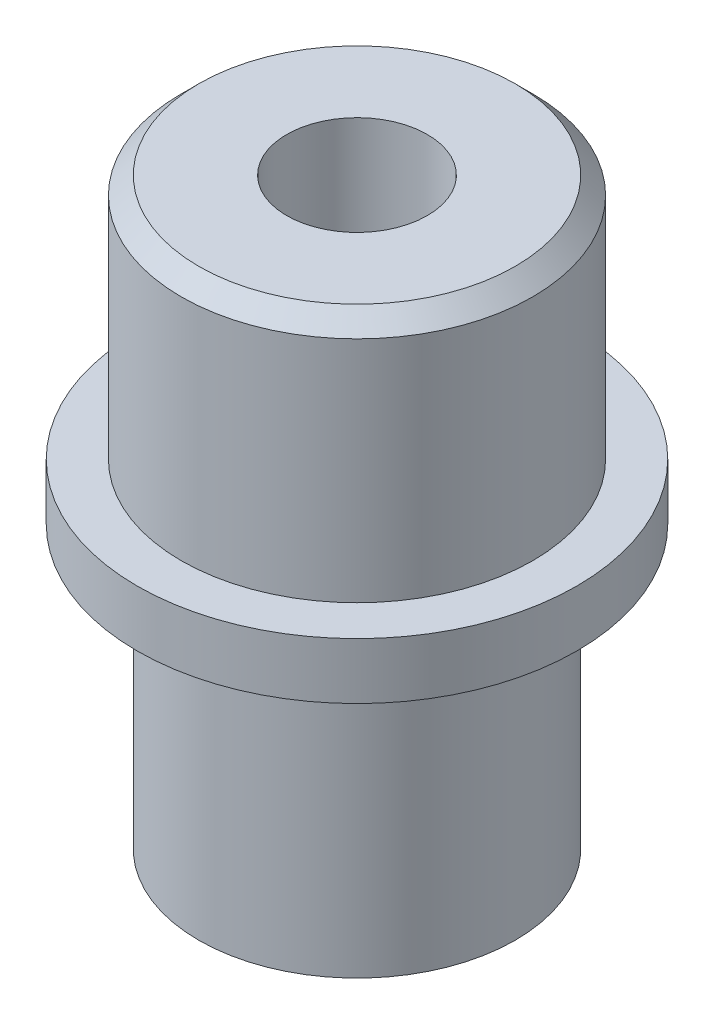
ISO-10303-21;
HEADER;
FILE_DESCRIPTION(('STEP AP214'),'2;1');
FILE_NAME('part.step','',(''),(''),'','','');
FILE_SCHEMA(('AUTOMOTIVE_DESIGN { 1 0 10303 214 1 1 1 1 }'));
ENDSEC;
DATA;
#1=APPLICATION_CONTEXT('core data for automotive mechanical design processes');
#2=APPLICATION_PROTOCOL_DEFINITION('international standard','automotive_design',2000,#1);
#3=PRODUCT_CONTEXT('',#1,'mechanical');
#4=PRODUCT('Part','Part','',(#3));
#5=PRODUCT_RELATED_PRODUCT_CATEGORY('part','',(#4));
#6=PRODUCT_DEFINITION_FORMATION('','',#4);
#7=PRODUCT_DEFINITION_CONTEXT('part definition',#1,'design');
#8=PRODUCT_DEFINITION('design','',#6,#7);
#9=PRODUCT_DEFINITION_SHAPE('','',#8);
#10=(LENGTH_UNIT() NAMED_UNIT(*) SI_UNIT(.MILLI.,.METRE.));
#11=(NAMED_UNIT(*) PLANE_ANGLE_UNIT() SI_UNIT($,.RADIAN.));
#12=(NAMED_UNIT(*) SI_UNIT($,.STERADIAN.) SOLID_ANGLE_UNIT());
#13=UNCERTAINTY_MEASURE_WITH_UNIT(LENGTH_MEASURE(1.E-05),#10,'distance_accuracy_value','');
#14=(GEOMETRIC_REPRESENTATION_CONTEXT(3) GLOBAL_UNCERTAINTY_ASSIGNED_CONTEXT((#13)) GLOBAL_UNIT_ASSIGNED_CONTEXT((#10,
#11,#12)) REPRESENTATION_CONTEXT('',''));
#15=CARTESIAN_POINT('',(0.,0.,0.));
#16=DIRECTION('',(0.,0.,1.));
#17=DIRECTION('',(1.,0.,0.));
#18=AXIS2_PLACEMENT_3D('',#15,#16,#17);
#19=CARTESIAN_POINT('',(0.,0.,0.));
#20=DIRECTION('',(0.,-1.,0.));
#21=DIRECTION('',(1.,0.,0.));
#22=AXIS2_PLACEMENT_3D('',#19,#20,#21);
#23=CYLINDRICAL_SURFACE('',#22,6.35);
#24=CARTESIAN_POINT('',(0.,12.4138028169014,0.));
#25=DIRECTION('',(0.,-1.,0.));
#26=DIRECTION('',(1.,0.,0.));
#27=AXIS2_PLACEMENT_3D('',#24,#25,#26);
#28=CIRCLE('',#27,6.35);
#29=CARTESIAN_POINT('',(6.35,12.4138028169014,0.));
#30=VERTEX_POINT('',#29);
#31=EDGE_CURVE('E37',#30,#30,#28,.T.);
#32=ORIENTED_EDGE('',*,*,#31,.T.);
#33=EDGE_LOOP('',(#32));
#34=FACE_BOUND('',#33,.T.);
#35=CARTESIAN_POINT('',(0.,4.15880281690141,0.));
#36=DIRECTION('',(0.,-1.,0.));
#37=DIRECTION('',(1.,0.,0.));
#38=AXIS2_PLACEMENT_3D('',#35,#36,#37);
#39=CIRCLE('',#38,6.35);
#40=CARTESIAN_POINT('',(6.35,4.15880281690141,0.));
#41=VERTEX_POINT('',#40);
#42=EDGE_CURVE('E62',#41,#41,#39,.T.);
#43=ORIENTED_EDGE('',*,*,#42,.F.);
#44=EDGE_LOOP('',(#43));
#45=FACE_BOUND('',#44,.T.);
#46=ADVANCED_FACE('F30',(#34,#45),#23,.T.);
#47=CARTESIAN_POINT('',(-2.54,13.0488028169014,0.));
#48=DIRECTION('',(0.,-1.,0.));
#49=DIRECTION('',(1.,0.,0.));
#50=AXIS2_PLACEMENT_3D('',#47,#48,#49);
#51=PLANE('',#50);
#52=CARTESIAN_POINT('',(0.,13.0488028169014,0.));
#53=DIRECTION('',(0.,-1.,0.));
#54=DIRECTION('',(1.,0.,0.));
#55=AXIS2_PLACEMENT_3D('',#52,#53,#54);
#56=CIRCLE('',#55,5.715);
#57=CARTESIAN_POINT('',(5.71500000000001,13.0488028169014,0.));
#58=VERTEX_POINT('',#57);
#59=EDGE_CURVE('E10',#58,#58,#56,.F.);
#60=ORIENTED_EDGE('',*,*,#59,.T.);
#61=EDGE_LOOP('',(#60));
#62=FACE_BOUND('',#61,.T.);
#63=CARTESIAN_POINT('',(0.,13.0488028169014,0.));
#64=DIRECTION('',(0.,-1.,0.));
#65=DIRECTION('',(1.,0.,0.));
#66=AXIS2_PLACEMENT_3D('',#63,#64,#65);
#67=CIRCLE('',#66,2.54);
#68=CARTESIAN_POINT('',(2.54000000000001,13.0488028169014,0.));
#69=VERTEX_POINT('',#68);
#70=EDGE_CURVE('E41',#69,#69,#67,.T.);
#71=ORIENTED_EDGE('',*,*,#70,.T.);
#72=EDGE_LOOP('',(#71));
#73=FACE_BOUND('',#72,.T.);
#74=ADVANCED_FACE('F69',(#62,#73),#51,.F.);
#75=CARTESIAN_POINT('',(0.,0.,0.));
#76=DIRECTION('',(0.,-1.,0.));
#77=DIRECTION('',(1.,0.,0.));
#78=AXIS2_PLACEMENT_3D('',#75,#76,#77);
#79=CYLINDRICAL_SURFACE('',#78,2.54);
#80=ORIENTED_EDGE('',*,*,#70,.F.);
#81=EDGE_LOOP('',(#80));
#82=FACE_BOUND('',#81,.T.);
#83=CARTESIAN_POINT('',(0.,7.96880281690141,0.));
#84=DIRECTION('',(0.,-1.,0.));
#85=DIRECTION('',(1.,0.,0.));
#86=AXIS2_PLACEMENT_3D('',#83,#84,#85);
#87=CIRCLE('',#86,2.54);
#88=CARTESIAN_POINT('',(2.54,7.96880281690141,0.));
#89=VERTEX_POINT('',#88);
#90=EDGE_CURVE('E45',#89,#89,#87,.T.);
#91=ORIENTED_EDGE('',*,*,#90,.T.);
#92=EDGE_LOOP('',(#91));
#93=FACE_BOUND('',#92,.T.);
#94=ADVANCED_FACE('F73',(#82,#93),#79,.F.);
#95=CARTESIAN_POINT('',(-2.54,7.96880281690142,0.));
#96=DIRECTION('',(0.,-1.,0.));
#97=DIRECTION('',(1.,0.,0.));
#98=AXIS2_PLACEMENT_3D('',#95,#96,#97);
#99=PLANE('',#98);
#100=ORIENTED_EDGE('',*,*,#90,.F.);
#101=EDGE_LOOP('',(#100));
#102=FACE_BOUND('',#101,.T.);
#103=ADVANCED_FACE('F78',(#102),#99,.F.);
#104=CARTESIAN_POINT('',(-5.715,-8.03319718309859,0.));
#105=DIRECTION('',(0.,1.,0.));
#106=DIRECTION('',(-1.,0.,0.));
#107=AXIS2_PLACEMENT_3D('',#104,#105,#106);
#108=PLANE('',#107);
#109=CARTESIAN_POINT('',(0.,-8.03319718309859,0.));
#110=DIRECTION('',(0.,-1.,0.));
#111=DIRECTION('',(1.,0.,0.));
#112=AXIS2_PLACEMENT_3D('',#109,#110,#111);
#113=CIRCLE('',#112,5.715);
#114=CARTESIAN_POINT('',(5.715,-8.03319718309859,0.));
#115=VERTEX_POINT('',#114);
#116=EDGE_CURVE('E50',#115,#115,#113,.T.);
#117=ORIENTED_EDGE('',*,*,#116,.T.);
#118=EDGE_LOOP('',(#117));
#119=FACE_BOUND('',#118,.T.);
#120=ADVANCED_FACE('F82',(#119),#108,.F.);
#121=CARTESIAN_POINT('',(0.,0.,0.));
#122=DIRECTION('',(0.,-1.,0.));
#123=DIRECTION('',(1.,0.,0.));
#124=AXIS2_PLACEMENT_3D('',#121,#122,#123);
#125=CYLINDRICAL_SURFACE('',#124,5.715);
#126=ORIENTED_EDGE('',*,*,#116,.F.);
#127=EDGE_LOOP('',(#126));
#128=FACE_BOUND('',#127,.T.);
#129=CARTESIAN_POINT('',(0.,2.12680281690141,0.));
#130=DIRECTION('',(0.,-1.,0.));
#131=DIRECTION('',(1.,0.,0.));
#132=AXIS2_PLACEMENT_3D('',#129,#130,#131);
#133=CIRCLE('',#132,5.715);
#134=CARTESIAN_POINT('',(5.715,2.12680281690141,0.));
#135=VERTEX_POINT('',#134);
#136=EDGE_CURVE('E53',#135,#135,#133,.T.);
#137=ORIENTED_EDGE('',*,*,#136,.T.);
#138=EDGE_LOOP('',(#137));
#139=FACE_BOUND('',#138,.T.);
#140=ADVANCED_FACE('F86',(#128,#139),#125,.T.);
#141=CARTESIAN_POINT('',(-7.9375,2.12680281690141,0.));
#142=DIRECTION('',(0.,1.,0.));
#143=DIRECTION('',(-1.,0.,0.));
#144=AXIS2_PLACEMENT_3D('',#141,#142,#143);
#145=PLANE('',#144);
#146=ORIENTED_EDGE('',*,*,#136,.F.);
#147=EDGE_LOOP('',(#146));
#148=FACE_BOUND('',#147,.T.);
#149=CARTESIAN_POINT('',(0.,2.12680281690141,0.));
#150=DIRECTION('',(0.,-1.,0.));
#151=DIRECTION('',(1.,0.,0.));
#152=AXIS2_PLACEMENT_3D('',#149,#150,#151);
#153=CIRCLE('',#152,7.9375);
#154=CARTESIAN_POINT('',(7.9375,2.12680281690141,0.));
#155=VERTEX_POINT('',#154);
#156=EDGE_CURVE('E56',#155,#155,#153,.T.);
#157=ORIENTED_EDGE('',*,*,#156,.T.);
#158=EDGE_LOOP('',(#157));
#159=FACE_BOUND('',#158,.T.);
#160=ADVANCED_FACE('F90',(#148,#159),#145,.F.);
#161=CARTESIAN_POINT('',(0.,0.,0.));
#162=DIRECTION('',(0.,-1.,0.));
#163=DIRECTION('',(1.,0.,0.));
#164=AXIS2_PLACEMENT_3D('',#161,#162,#163);
#165=CYLINDRICAL_SURFACE('',#164,7.9375);
#166=ORIENTED_EDGE('',*,*,#156,.F.);
#167=EDGE_LOOP('',(#166));
#168=FACE_BOUND('',#167,.T.);
#169=CARTESIAN_POINT('',(0.,4.15880281690141,0.));
#170=DIRECTION('',(0.,-1.,0.));
#171=DIRECTION('',(1.,0.,0.));
#172=AXIS2_PLACEMENT_3D('',#169,#170,#171);
#173=CIRCLE('',#172,7.9375);
#174=CARTESIAN_POINT('',(7.9375,4.15880281690141,0.));
#175=VERTEX_POINT('',#174);
#176=EDGE_CURVE('E59',#175,#175,#173,.T.);
#177=ORIENTED_EDGE('',*,*,#176,.T.);
#178=EDGE_LOOP('',(#177));
#179=FACE_BOUND('',#178,.T.);
#180=ADVANCED_FACE('F94',(#168,#179),#165,.T.);
#181=CARTESIAN_POINT('',(-6.35,4.15880281690141,0.));
#182=DIRECTION('',(0.,-1.,0.));
#183=DIRECTION('',(1.,0.,0.));
#184=AXIS2_PLACEMENT_3D('',#181,#182,#183);
#185=PLANE('',#184);
#186=ORIENTED_EDGE('',*,*,#176,.F.);
#187=EDGE_LOOP('',(#186));
#188=FACE_BOUND('',#187,.T.);
#189=ORIENTED_EDGE('',*,*,#42,.T.);
#190=EDGE_LOOP('',(#189));
#191=FACE_BOUND('',#190,.T.);
#192=ADVANCED_FACE('F66',(#188,#191),#185,.F.);
#193=CARTESIAN_POINT('',(0.,12.4138028169014,0.));
#194=DIRECTION('',(0.,-1.,0.));
#195=DIRECTION('',(1.,0.,0.));
#196=AXIS2_PLACEMENT_3D('',#193,#194,#195);
#197=CONICAL_SURFACE('',#196,6.35,0.78539816339745);
#198=ORIENTED_EDGE('',*,*,#59,.F.);
#199=EDGE_LOOP('',(#198));
#200=FACE_BOUND('',#199,.T.);
#201=ORIENTED_EDGE('',*,*,#31,.F.);
#202=EDGE_LOOP('',(#201));
#203=FACE_BOUND('',#202,.T.);
#204=ADVANCED_FACE('F32',(#200,#203),#197,.T.);
#205=CLOSED_SHELL('',(#46,#74,#94,#103,#120,#140,#160,#180,#192,#204));
#206=MANIFOLD_SOLID_BREP('B2',#205);
#207=ADVANCED_BREP_SHAPE_REPRESENTATION('',(#18,#206),#14);
#208=SHAPE_DEFINITION_REPRESENTATION(#9,#207);
ENDSEC;
END-ISO-10303-21;
